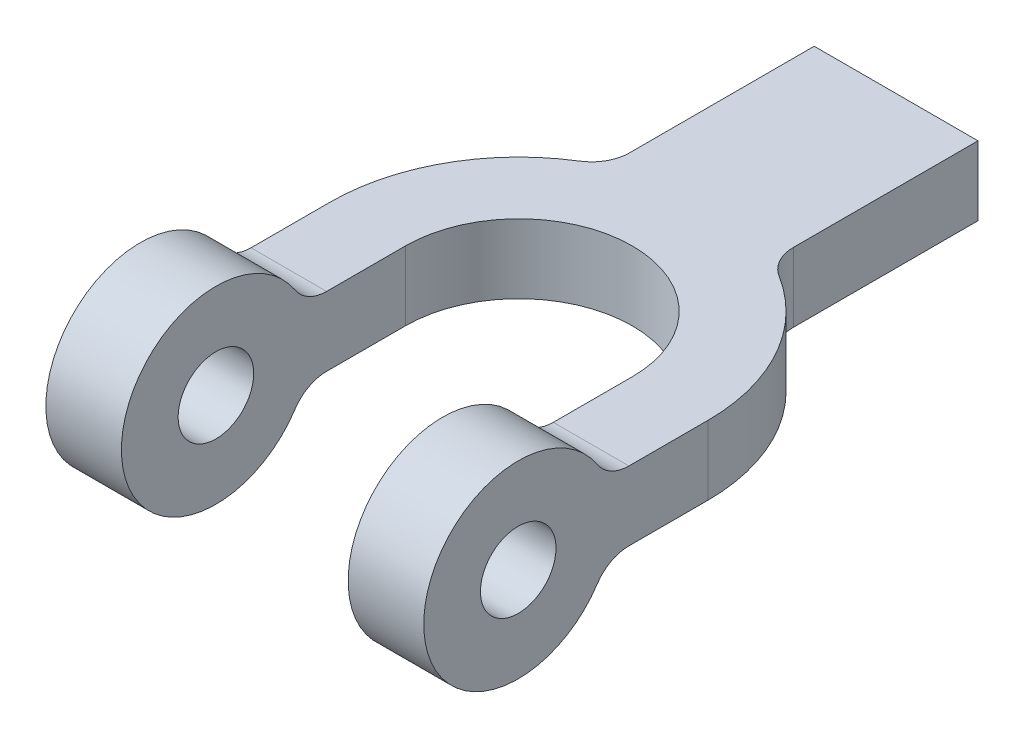
ISO-10303-21;
HEADER;
FILE_DESCRIPTION(('STEP AP214'),'2;1');
FILE_NAME('part.step','',(''),(''),'','','');
FILE_SCHEMA(('AUTOMOTIVE_DESIGN { 1 0 10303 214 1 1 1 1 }'));
ENDSEC;
DATA;
#1=APPLICATION_CONTEXT('core data for automotive mechanical design processes');
#2=APPLICATION_PROTOCOL_DEFINITION('international standard','automotive_design',2000,#1);
#3=PRODUCT_CONTEXT('',#1,'mechanical');
#4=PRODUCT('Part','Part','',(#3));
#5=PRODUCT_RELATED_PRODUCT_CATEGORY('part','',(#4));
#6=PRODUCT_DEFINITION_FORMATION('','',#4);
#7=PRODUCT_DEFINITION_CONTEXT('part definition',#1,'design');
#8=PRODUCT_DEFINITION('design','',#6,#7);
#9=PRODUCT_DEFINITION_SHAPE('','',#8);
#10=(LENGTH_UNIT() NAMED_UNIT(*) SI_UNIT(.MILLI.,.METRE.));
#11=(NAMED_UNIT(*) PLANE_ANGLE_UNIT() SI_UNIT($,.RADIAN.));
#12=(NAMED_UNIT(*) SI_UNIT($,.STERADIAN.) SOLID_ANGLE_UNIT());
#13=UNCERTAINTY_MEASURE_WITH_UNIT(LENGTH_MEASURE(1.E-05),#10,'distance_accuracy_value','');
#14=(GEOMETRIC_REPRESENTATION_CONTEXT(3) GLOBAL_UNCERTAINTY_ASSIGNED_CONTEXT((#13)) GLOBAL_UNIT_ASSIGNED_CONTEXT((#10,
#11,#12)) REPRESENTATION_CONTEXT('',''));
#15=CARTESIAN_POINT('',(0.,0.,0.));
#16=DIRECTION('',(0.,0.,1.));
#17=DIRECTION('',(1.,0.,0.));
#18=AXIS2_PLACEMENT_3D('',#15,#16,#17);
#19=CARTESIAN_POINT('',(-100.,100.,175.));
#20=DIRECTION('',(1.,0.,0.));
#21=DIRECTION('',(0.,0.,-1.));
#22=AXIS2_PLACEMENT_3D('',#19,#20,#21);
#23=PLANE('',#22);
#24=CARTESIAN_POINT('',(-100.,50.,125.));
#25=DIRECTION('',(1.,0.,0.));
#26=DIRECTION('',(0.,0.,-1.));
#27=AXIS2_PLACEMENT_3D('',#24,#25,#26);
#28=CIRCLE('',#27,20.);
#29=CARTESIAN_POINT('',(-100.,50.,105.));
#30=VERTEX_POINT('',#29);
#31=EDGE_CURVE('E409',#30,#30,#28,.T.);
#32=ORIENTED_EDGE('',*,*,#31,.T.);
#33=EDGE_LOOP('',(#32));
#34=FACE_BOUND('',#33,.T.);
#35=DIRECTION('',(0.,0.,-1.));
#36=VECTOR('',#35,1.);
#37=CARTESIAN_POINT('',(-100.,31.6804590253236,0.));
#38=LINE('',#37,#36);
#39=CARTESIAN_POINT('',(-100.,31.6804590253236,66.4200309022777));
#40=VERTEX_POINT('',#39);
#41=CARTESIAN_POINT('',(-100.,31.6804590253236,24.6443211616333));
#42=VERTEX_POINT('',#41);
#43=EDGE_CURVE('E282',#40,#42,#38,.T.);
#44=ORIENTED_EDGE('',*,*,#43,.F.);
#45=CARTESIAN_POINT('',(-100.,11.6804590253236,66.4200309022777));
#46=DIRECTION('',(1.,0.,0.));
#47=DIRECTION('',(0.,0.,-1.));
#48=AXIS2_PLACEMENT_3D('',#45,#46,#47);
#49=CIRCLE('',#48,20.);
#50=CARTESIAN_POINT('',(-100.,22.6288993038025,83.1571649301984));
#51=VERTEX_POINT('',#50);
#52=EDGE_CURVE('E293',#40,#51,#49,.T.);
#53=ORIENTED_EDGE('',*,*,#52,.T.);
#54=CARTESIAN_POINT('',(-100.,50.,125.));
#55=DIRECTION('',(1.,0.,0.));
#56=DIRECTION('',(0.,0.,-1.));
#57=AXIS2_PLACEMENT_3D('',#54,#55,#56);
#58=CIRCLE('',#57,50.);
#59=CARTESIAN_POINT('',(-100.,77.3711006961975,83.1571649301984));
#60=VERTEX_POINT('',#59);
#61=EDGE_CURVE('E422',#60,#51,#58,.T.);
#62=ORIENTED_EDGE('',*,*,#61,.F.);
#63=CARTESIAN_POINT('',(-100.,88.3195409746764,66.4200309022777));
#64=DIRECTION('',(1.,0.,0.));
#65=DIRECTION('',(0.,0.,-1.));
#66=AXIS2_PLACEMENT_3D('',#63,#64,#65);
#67=CIRCLE('',#66,20.);
#68=CARTESIAN_POINT('',(-100.,68.3195409746764,66.4200309022777));
#69=VERTEX_POINT('',#68);
#70=EDGE_CURVE('E322',#69,#60,#67,.F.);
#71=ORIENTED_EDGE('',*,*,#70,.F.);
#72=DIRECTION('',(0.,0.,-1.));
#73=VECTOR('',#72,1.);
#74=CARTESIAN_POINT('',(-100.,68.3195409746764,0.));
#75=LINE('',#74,#73);
#76=CARTESIAN_POINT('',(-100.,68.3195409746764,24.6443211616333));
#77=VERTEX_POINT('',#76);
#78=EDGE_CURVE('E326',#69,#77,#75,.T.);
#79=ORIENTED_EDGE('',*,*,#78,.T.);
#80=DIRECTION('',(0.,1.,0.));
#81=VECTOR('',#80,1.);
#82=CARTESIAN_POINT('',(-100.,0.,24.6443211616333));
#83=LINE('',#82,#81);
#84=EDGE_CURVE('E303',#42,#77,#83,.T.);
#85=ORIENTED_EDGE('',*,*,#84,.F.);
#86=EDGE_LOOP('',(#44,#53,#62,#71,#79,#85));
#87=FACE_BOUND('',#86,.T.);
#88=ADVANCED_FACE('F153',(#34,#87),#23,.F.);
#89=CARTESIAN_POINT('',(100.,100.,175.));
#90=DIRECTION('',(-1.,0.,0.));
#91=DIRECTION('',(0.,0.,1.));
#92=AXIS2_PLACEMENT_3D('',#89,#90,#91);
#93=PLANE('',#92);
#94=CARTESIAN_POINT('',(100.,50.,125.));
#95=DIRECTION('',(1.,0.,0.));
#96=DIRECTION('',(0.,0.,-1.));
#97=AXIS2_PLACEMENT_3D('',#94,#95,#96);
#98=CIRCLE('',#97,20.);
#99=CARTESIAN_POINT('',(100.,50.,105.));
#100=VERTEX_POINT('',#99);
#101=EDGE_CURVE('E408',#100,#100,#98,.T.);
#102=ORIENTED_EDGE('',*,*,#101,.F.);
#103=EDGE_LOOP('',(#102));
#104=FACE_BOUND('',#103,.T.);
#105=DIRECTION('',(0.,0.,-1.));
#106=VECTOR('',#105,1.);
#107=CARTESIAN_POINT('',(100.,31.6804590253236,0.));
#108=LINE('',#107,#106);
#109=CARTESIAN_POINT('',(100.,31.6804590253236,66.4200309022777));
#110=VERTEX_POINT('',#109);
#111=CARTESIAN_POINT('',(100.,31.6804590253236,24.6443211616333));
#112=VERTEX_POINT('',#111);
#113=EDGE_CURVE('E309',#110,#112,#108,.T.);
#114=ORIENTED_EDGE('',*,*,#113,.T.);
#115=DIRECTION('',(0.,1.,0.));
#116=VECTOR('',#115,1.);
#117=CARTESIAN_POINT('',(100.,0.,24.6443211616333));
#118=LINE('',#117,#116);
#119=CARTESIAN_POINT('',(100.,68.3195409746764,24.6443211616333));
#120=VERTEX_POINT('',#119);
#121=EDGE_CURVE('E434',#112,#120,#118,.T.);
#122=ORIENTED_EDGE('',*,*,#121,.T.);
#123=DIRECTION('',(0.,0.,-1.));
#124=VECTOR('',#123,1.);
#125=CARTESIAN_POINT('',(100.,68.3195409746764,0.));
#126=LINE('',#125,#124);
#127=CARTESIAN_POINT('',(100.,68.3195409746764,66.4200309022777));
#128=VERTEX_POINT('',#127);
#129=EDGE_CURVE('E327',#128,#120,#126,.T.);
#130=ORIENTED_EDGE('',*,*,#129,.F.);
#131=CARTESIAN_POINT('',(100.,88.3195409746764,66.4200309022777));
#132=DIRECTION('',(1.,0.,0.));
#133=DIRECTION('',(0.,0.,-1.));
#134=AXIS2_PLACEMENT_3D('',#131,#132,#133);
#135=CIRCLE('',#134,20.);
#136=CARTESIAN_POINT('',(100.,77.3711006961975,83.1571649301984));
#137=VERTEX_POINT('',#136);
#138=EDGE_CURVE('E331',#128,#137,#135,.F.);
#139=ORIENTED_EDGE('',*,*,#138,.T.);
#140=CARTESIAN_POINT('',(100.,50.,125.));
#141=DIRECTION('',(1.,0.,0.));
#142=DIRECTION('',(0.,0.,-1.));
#143=AXIS2_PLACEMENT_3D('',#140,#141,#142);
#144=CIRCLE('',#143,50.);
#145=CARTESIAN_POINT('',(100.,22.6288993038025,83.1571649301984));
#146=VERTEX_POINT('',#145);
#147=EDGE_CURVE('E421',#137,#146,#144,.T.);
#148=ORIENTED_EDGE('',*,*,#147,.T.);
#149=CARTESIAN_POINT('',(100.,11.6804590253236,66.4200309022777));
#150=DIRECTION('',(1.,0.,0.));
#151=DIRECTION('',(0.,0.,-1.));
#152=AXIS2_PLACEMENT_3D('',#149,#150,#151);
#153=CIRCLE('',#152,20.);
#154=EDGE_CURVE('E305',#110,#146,#153,.T.);
#155=ORIENTED_EDGE('',*,*,#154,.F.);
#156=EDGE_LOOP('',(#114,#122,#130,#139,#148,#155));
#157=FACE_BOUND('',#156,.T.);
#158=ADVANCED_FACE('F499',(#104,#157),#93,.F.);
#159=CARTESIAN_POINT('',(-60.,0.,0.));
#160=DIRECTION('',(-1.,0.,0.));
#161=DIRECTION('',(0.,0.,1.));
#162=AXIS2_PLACEMENT_3D('',#159,#160,#161);
#163=PLANE('',#162);
#164=CARTESIAN_POINT('',(-60.,50.,125.));
#165=DIRECTION('',(-1.,0.,0.));
#166=DIRECTION('',(0.,0.,1.));
#167=AXIS2_PLACEMENT_3D('',#164,#165,#166);
#168=CIRCLE('',#167,20.);
#169=CARTESIAN_POINT('',(-60.,50.,145.));
#170=VERTEX_POINT('',#169);
#171=EDGE_CURVE('E417',#170,#170,#168,.T.);
#172=ORIENTED_EDGE('',*,*,#171,.T.);
#173=EDGE_LOOP('',(#172));
#174=FACE_BOUND('',#173,.T.);
#175=DIRECTION('',(0.,0.,1.));
#176=VECTOR('',#175,1.);
#177=CARTESIAN_POINT('',(-60.,31.6804590253236,0.));
#178=LINE('',#177,#176);
#179=CARTESIAN_POINT('',(-60.,31.6804590253236,24.6443211616333));
#180=VERTEX_POINT('',#179);
#181=CARTESIAN_POINT('',(-60.,31.6804590253236,66.4200309022777));
#182=VERTEX_POINT('',#181);
#183=EDGE_CURVE('E285',#180,#182,#178,.T.);
#184=ORIENTED_EDGE('',*,*,#183,.F.);
#185=DIRECTION('',(0.,1.,0.));
#186=VECTOR('',#185,1.);
#187=CARTESIAN_POINT('',(-60.,0.,24.6443211616333));
#188=LINE('',#187,#186);
#189=CARTESIAN_POINT('',(-60.,68.3195409746764,24.6443211616333));
#190=VERTEX_POINT('',#189);
#191=EDGE_CURVE('E430',#180,#190,#188,.T.);
#192=ORIENTED_EDGE('',*,*,#191,.T.);
#193=DIRECTION('',(0.,0.,1.));
#194=VECTOR('',#193,1.);
#195=CARTESIAN_POINT('',(-60.,68.3195409746764,0.));
#196=LINE('',#195,#194);
#197=CARTESIAN_POINT('',(-60.,68.3195409746764,66.4200309022777));
#198=VERTEX_POINT('',#197);
#199=EDGE_CURVE('E362',#190,#198,#196,.T.);
#200=ORIENTED_EDGE('',*,*,#199,.T.);
#201=CARTESIAN_POINT('',(-60.,88.3195409746764,66.4200309022777));
#202=DIRECTION('',(-1.,0.,0.));
#203=DIRECTION('',(0.,0.,1.));
#204=AXIS2_PLACEMENT_3D('',#201,#202,#203);
#205=CIRCLE('',#204,20.);
#206=CARTESIAN_POINT('',(-60.,77.3711006961975,83.1571649301984));
#207=VERTEX_POINT('',#206);
#208=EDGE_CURVE('E402',#207,#198,#205,.F.);
#209=ORIENTED_EDGE('',*,*,#208,.F.);
#210=CARTESIAN_POINT('',(-60.,50.,125.));
#211=DIRECTION('',(-1.,0.,0.));
#212=DIRECTION('',(0.,0.,1.));
#213=AXIS2_PLACEMENT_3D('',#210,#211,#212);
#214=CIRCLE('',#213,50.);
#215=CARTESIAN_POINT('',(-60.,22.6288993038025,83.1571649301984));
#216=VERTEX_POINT('',#215);
#217=EDGE_CURVE('E176',#216,#207,#214,.T.);
#218=ORIENTED_EDGE('',*,*,#217,.F.);
#219=CARTESIAN_POINT('',(-60.,11.6804590253236,66.4200309022777));
#220=DIRECTION('',(-1.,0.,0.));
#221=DIRECTION('',(0.,0.,1.));
#222=AXIS2_PLACEMENT_3D('',#219,#220,#221);
#223=CIRCLE('',#222,20.);
#224=EDGE_CURVE('E405',#216,#182,#223,.T.);
#225=ORIENTED_EDGE('',*,*,#224,.T.);
#226=EDGE_LOOP('',(#184,#192,#200,#209,#218,#225));
#227=FACE_BOUND('',#226,.T.);
#228=ADVANCED_FACE('F552',(#174,#227),#163,.F.);
#229=CARTESIAN_POINT('',(60.,0.,0.));
#230=DIRECTION('',(-1.,0.,0.));
#231=DIRECTION('',(0.,0.,1.));
#232=AXIS2_PLACEMENT_3D('',#229,#230,#231);
#233=PLANE('',#232);
#234=CARTESIAN_POINT('',(60.,50.,125.));
#235=DIRECTION('',(-1.,0.,0.));
#236=DIRECTION('',(0.,0.,1.));
#237=AXIS2_PLACEMENT_3D('',#234,#235,#236);
#238=CIRCLE('',#237,20.);
#239=CARTESIAN_POINT('',(60.,50.,145.));
#240=VERTEX_POINT('',#239);
#241=EDGE_CURVE('E413',#240,#240,#238,.T.);
#242=ORIENTED_EDGE('',*,*,#241,.F.);
#243=EDGE_LOOP('',(#242));
#244=FACE_BOUND('',#243,.T.);
#245=DIRECTION('',(0.,1.,0.));
#246=VECTOR('',#245,1.);
#247=CARTESIAN_POINT('',(60.,0.,24.6443211616333));
#248=LINE('',#247,#246);
#249=CARTESIAN_POINT('',(60.,31.6804590253236,24.6443211616333));
#250=VERTEX_POINT('',#249);
#251=CARTESIAN_POINT('',(60.,68.3195409746764,24.6443211616333));
#252=VERTEX_POINT('',#251);
#253=EDGE_CURVE('E429',#250,#252,#248,.T.);
#254=ORIENTED_EDGE('',*,*,#253,.F.);
#255=DIRECTION('',(0.,0.,1.));
#256=VECTOR('',#255,1.);
#257=CARTESIAN_POINT('',(60.,31.6804590253236,0.));
#258=LINE('',#257,#256);
#259=CARTESIAN_POINT('',(60.,31.6804590253236,66.4200309022777));
#260=VERTEX_POINT('',#259);
#261=EDGE_CURVE('E386',#250,#260,#258,.T.);
#262=ORIENTED_EDGE('',*,*,#261,.T.);
#263=CARTESIAN_POINT('',(60.,11.6804590253236,66.4200309022777));
#264=DIRECTION('',(-1.,0.,0.));
#265=DIRECTION('',(0.,0.,1.));
#266=AXIS2_PLACEMENT_3D('',#263,#264,#265);
#267=CIRCLE('',#266,20.);
#268=CARTESIAN_POINT('',(60.,22.6288993038025,83.1571649301984));
#269=VERTEX_POINT('',#268);
#270=EDGE_CURVE('E12',#269,#260,#267,.T.);
#271=ORIENTED_EDGE('',*,*,#270,.F.);
#272=CARTESIAN_POINT('',(60.,50.,125.));
#273=DIRECTION('',(-1.,0.,0.));
#274=DIRECTION('',(0.,0.,1.));
#275=AXIS2_PLACEMENT_3D('',#272,#273,#274);
#276=CIRCLE('',#275,50.);
#277=CARTESIAN_POINT('',(60.,77.3711006961975,83.1571649301984));
#278=VERTEX_POINT('',#277);
#279=EDGE_CURVE('E168',#269,#278,#276,.T.);
#280=ORIENTED_EDGE('',*,*,#279,.T.);
#281=CARTESIAN_POINT('',(60.,88.3195409746764,66.4200309022777));
#282=DIRECTION('',(-1.,0.,0.));
#283=DIRECTION('',(0.,0.,1.));
#284=AXIS2_PLACEMENT_3D('',#281,#282,#283);
#285=CIRCLE('',#284,20.);
#286=CARTESIAN_POINT('',(60.,68.3195409746764,66.4200309022777));
#287=VERTEX_POINT('',#286);
#288=EDGE_CURVE('E161',#278,#287,#285,.F.);
#289=ORIENTED_EDGE('',*,*,#288,.T.);
#290=DIRECTION('',(0.,0.,1.));
#291=VECTOR('',#290,1.);
#292=CARTESIAN_POINT('',(60.,68.3195409746764,0.));
#293=LINE('',#292,#291);
#294=EDGE_CURVE('E359',#252,#287,#293,.T.);
#295=ORIENTED_EDGE('',*,*,#294,.F.);
#296=EDGE_LOOP('',(#254,#262,#271,#280,#289,#295));
#297=FACE_BOUND('',#296,.T.);
#298=ADVANCED_FACE('F484',(#244,#297),#233,.T.);
#299=CARTESIAN_POINT('',(100.,100.,-175.));
#300=DIRECTION('',(0.,0.,1.));
#301=DIRECTION('',(1.,0.,0.));
#302=AXIS2_PLACEMENT_3D('',#299,#300,#301);
#303=PLANE('',#302);
#304=DIRECTION('',(1.,0.,0.));
#305=VECTOR('',#304,1.);
#306=CARTESIAN_POINT('',(-100.,31.6804590253236,-175.));
#307=LINE('',#306,#305);
#308=CARTESIAN_POINT('',(-43.347633030871,31.6804590253236,-175.));
#309=VERTEX_POINT('',#308);
#310=CARTESIAN_POINT('',(43.3476330308709,31.6804590253236,-175.));
#311=VERTEX_POINT('',#310);
#312=EDGE_CURVE('E316',#309,#311,#307,.T.);
#313=ORIENTED_EDGE('',*,*,#312,.F.);
#314=DIRECTION('',(0.,1.,0.));
#315=VECTOR('',#314,1.);
#316=CARTESIAN_POINT('',(-43.3476330308709,0.,-175.));
#317=LINE('',#316,#315);
#318=CARTESIAN_POINT('',(-43.3476330308709,68.3195409746764,-175.));
#319=VERTEX_POINT('',#318);
#320=EDGE_CURVE('E456',#309,#319,#317,.T.);
#321=ORIENTED_EDGE('',*,*,#320,.T.);
#322=DIRECTION('',(1.,0.,0.));
#323=VECTOR('',#322,1.);
#324=CARTESIAN_POINT('',(-100.,68.3195409746764,-175.));
#325=LINE('',#324,#323);
#326=CARTESIAN_POINT('',(43.3476330308709,68.3195409746764,-175.));
#327=VERTEX_POINT('',#326);
#328=EDGE_CURVE('E341',#319,#327,#325,.T.);
#329=ORIENTED_EDGE('',*,*,#328,.T.);
#330=DIRECTION('',(0.,1.,0.));
#331=VECTOR('',#330,1.);
#332=CARTESIAN_POINT('',(43.3476330308709,0.,-175.));
#333=LINE('',#332,#331);
#334=EDGE_CURVE('E447',#311,#327,#333,.T.);
#335=ORIENTED_EDGE('',*,*,#334,.F.);
#336=EDGE_LOOP('',(#313,#321,#329,#335));
#337=FACE_BOUND('',#336,.T.);
#338=ADVANCED_FACE('F517',(#337),#303,.F.);
#339=CARTESIAN_POINT('',(0.,0.,24.6443211616333));
#340=DIRECTION('',(0.,1.,0.));
#341=DIRECTION('',(0.,0.,1.));
#342=AXIS2_PLACEMENT_3D('',#339,#340,#341);
#343=CYLINDRICAL_SURFACE('',#342,100.);
#344=DIRECTION('',(0.,1.,0.));
#345=VECTOR('',#344,1.);
#346=CARTESIAN_POINT('',(-52.7896941923924,0.,-60.2865223940132));
#347=LINE('',#346,#345);
#348=CARTESIAN_POINT('',(-52.7896941923924,31.6804590253236,-60.2865223940132));
#349=VERTEX_POINT('',#348);
#350=CARTESIAN_POINT('',(-52.7896941923924,68.3195409746764,-60.2865223940132));
#351=VERTEX_POINT('',#350);
#352=EDGE_CURVE('E442',#349,#351,#347,.T.);
#353=ORIENTED_EDGE('',*,*,#352,.F.);
#354=CARTESIAN_POINT('',(0.,31.6804590253236,24.6443211616333));
#355=DIRECTION('',(0.,-1.,0.));
#356=DIRECTION('',(0.,0.,-1.));
#357=AXIS2_PLACEMENT_3D('',#354,#355,#356);
#358=CIRCLE('',#357,100.);
#359=EDGE_CURVE('E399',#349,#42,#358,.F.);
#360=ORIENTED_EDGE('',*,*,#359,.T.);
#361=ORIENTED_EDGE('',*,*,#84,.T.);
#362=CARTESIAN_POINT('',(0.,68.3195409746764,24.6443211616333));
#363=DIRECTION('',(0.,-1.,0.));
#364=DIRECTION('',(0.,0.,-1.));
#365=AXIS2_PLACEMENT_3D('',#362,#363,#364);
#366=CIRCLE('',#365,100.);
#367=EDGE_CURVE('E373',#351,#77,#366,.F.);
#368=ORIENTED_EDGE('',*,*,#367,.F.);
#369=EDGE_LOOP('',(#353,#360,#361,#368));
#370=FACE_BOUND('',#369,.T.);
#371=ADVANCED_FACE('F528',(#370),#343,.T.);
#372=CARTESIAN_POINT('',(-43.3476330308709,0.,0.));
#373=DIRECTION('',(-1.,0.,0.));
#374=DIRECTION('',(0.,0.,1.));
#375=AXIS2_PLACEMENT_3D('',#372,#373,#374);
#376=PLANE('',#375);
#377=ORIENTED_EDGE('',*,*,#320,.F.);
#378=DIRECTION('',(0.,0.,1.));
#379=VECTOR('',#378,1.);
#380=CARTESIAN_POINT('',(-43.3476330308709,31.6804590253236,0.));
#381=LINE('',#380,#379);
#382=CARTESIAN_POINT('',(-43.3476330308709,31.6804590253236,-77.2726911051425));
#383=VERTEX_POINT('',#382);
#384=EDGE_CURVE('E395',#309,#383,#381,.T.);
#385=ORIENTED_EDGE('',*,*,#384,.T.);
#386=DIRECTION('',(0.,1.,0.));
#387=VECTOR('',#386,1.);
#388=CARTESIAN_POINT('',(-43.3476330308709,0.,-77.2726911051425));
#389=LINE('',#388,#387);
#390=CARTESIAN_POINT('',(-43.3476330308709,68.3195409746764,-77.2726911051425));
#391=VERTEX_POINT('',#390);
#392=EDGE_CURVE('E460',#383,#391,#389,.T.);
#393=ORIENTED_EDGE('',*,*,#392,.T.);
#394=DIRECTION('',(0.,0.,1.));
#395=VECTOR('',#394,1.);
#396=CARTESIAN_POINT('',(-43.3476330308709,68.3195409746764,0.));
#397=LINE('',#396,#395);
#398=EDGE_CURVE('E370',#319,#391,#397,.T.);
#399=ORIENTED_EDGE('',*,*,#398,.F.);
#400=EDGE_LOOP('',(#377,#385,#393,#399));
#401=FACE_BOUND('',#400,.T.);
#402=ADVANCED_FACE('F520',(#401),#376,.T.);
#403=CARTESIAN_POINT('',(-63.3476330308709,0.,-77.2726911051425));
#404=DIRECTION('',(0.,1.,0.));
#405=DIRECTION('',(0.,0.,1.));
#406=AXIS2_PLACEMENT_3D('',#403,#404,#405);
#407=CYLINDRICAL_SURFACE('',#406,20.);
#408=CARTESIAN_POINT('',(-63.3476330308709,31.6804590253236,-77.2726911051425));
#409=DIRECTION('',(0.,-1.,0.));
#410=DIRECTION('',(0.,0.,-1.));
#411=AXIS2_PLACEMENT_3D('',#408,#409,#410);
#412=CIRCLE('',#411,20.);
#413=EDGE_CURVE('E392',#349,#383,#412,.F.);
#414=ORIENTED_EDGE('',*,*,#413,.F.);
#415=ORIENTED_EDGE('',*,*,#352,.T.);
#416=CARTESIAN_POINT('',(-63.3476330308709,68.3195409746764,-77.2726911051425));
#417=DIRECTION('',(0.,-1.,0.));
#418=DIRECTION('',(0.,0.,-1.));
#419=AXIS2_PLACEMENT_3D('',#416,#417,#418);
#420=CIRCLE('',#419,20.);
#421=EDGE_CURVE('E366',#351,#391,#420,.F.);
#422=ORIENTED_EDGE('',*,*,#421,.T.);
#423=ORIENTED_EDGE('',*,*,#392,.F.);
#424=EDGE_LOOP('',(#414,#415,#422,#423));
#425=FACE_BOUND('',#424,.T.);
#426=ADVANCED_FACE('F525',(#425),#407,.F.);
#427=CARTESIAN_POINT('',(0.,0.,24.6443211616333));
#428=DIRECTION('',(0.,1.,0.));
#429=DIRECTION('',(0.,0.,1.));
#430=AXIS2_PLACEMENT_3D('',#427,#428,#429);
#431=CYLINDRICAL_SURFACE('',#430,60.);
#432=CARTESIAN_POINT('',(0.,31.6804590253236,24.6443211616333));
#433=DIRECTION('',(0.,-1.,0.));
#434=DIRECTION('',(0.,0.,-1.));
#435=AXIS2_PLACEMENT_3D('',#432,#433,#434);
#436=CIRCLE('',#435,60.);
#437=EDGE_CURVE('E383',#250,#180,#436,.F.);
#438=ORIENTED_EDGE('',*,*,#437,.F.);
#439=ORIENTED_EDGE('',*,*,#253,.T.);
#440=CARTESIAN_POINT('',(0.,68.3195409746764,24.6443211616333));
#441=DIRECTION('',(0.,-1.,0.));
#442=DIRECTION('',(0.,0.,-1.));
#443=AXIS2_PLACEMENT_3D('',#440,#441,#442);
#444=CIRCLE('',#443,60.);
#445=EDGE_CURVE('E355',#252,#190,#444,.F.);
#446=ORIENTED_EDGE('',*,*,#445,.T.);
#447=ORIENTED_EDGE('',*,*,#191,.F.);
#448=EDGE_LOOP('',(#438,#439,#446,#447));
#449=FACE_BOUND('',#448,.T.);
#450=ADVANCED_FACE('F565',(#449),#431,.F.);
#451=CARTESIAN_POINT('',(0.,0.,24.6443211616333));
#452=DIRECTION('',(0.,1.,0.));
#453=DIRECTION('',(0.,0.,1.));
#454=AXIS2_PLACEMENT_3D('',#451,#452,#453);
#455=CYLINDRICAL_SURFACE('',#454,100.);
#456=ORIENTED_EDGE('',*,*,#121,.F.);
#457=CARTESIAN_POINT('',(0.,31.6804590253236,24.6443211616333));
#458=DIRECTION('',(0.,-1.,0.));
#459=DIRECTION('',(0.,0.,-1.));
#460=AXIS2_PLACEMENT_3D('',#457,#458,#459);
#461=CIRCLE('',#460,100.);
#462=CARTESIAN_POINT('',(52.7896941923924,31.6804590253236,-60.2865223940132));
#463=VERTEX_POINT('',#462);
#464=EDGE_CURVE('E379',#112,#463,#461,.F.);
#465=ORIENTED_EDGE('',*,*,#464,.T.);
#466=DIRECTION('',(0.,1.,0.));
#467=VECTOR('',#466,1.);
#468=CARTESIAN_POINT('',(52.7896941923924,0.,-60.2865223940132));
#469=LINE('',#468,#467);
#470=CARTESIAN_POINT('',(52.7896941923924,68.3195409746764,-60.2865223940132));
#471=VERTEX_POINT('',#470);
#472=EDGE_CURVE('E438',#463,#471,#469,.T.);
#473=ORIENTED_EDGE('',*,*,#472,.T.);
#474=CARTESIAN_POINT('',(0.,68.3195409746764,24.6443211616333));
#475=DIRECTION('',(0.,-1.,0.));
#476=DIRECTION('',(0.,0.,-1.));
#477=AXIS2_PLACEMENT_3D('',#474,#475,#476);
#478=CIRCLE('',#477,100.);
#479=EDGE_CURVE('E352',#120,#471,#478,.F.);
#480=ORIENTED_EDGE('',*,*,#479,.F.);
#481=EDGE_LOOP('',(#456,#465,#473,#480));
#482=FACE_BOUND('',#481,.T.);
#483=ADVANCED_FACE('F504',(#482),#455,.T.);
#484=CARTESIAN_POINT('',(63.3476330308709,0.,-77.2726911051425));
#485=DIRECTION('',(0.,1.,0.));
#486=DIRECTION('',(0.,0.,1.));
#487=AXIS2_PLACEMENT_3D('',#484,#485,#486);
#488=CYLINDRICAL_SURFACE('',#487,20.);
#489=CARTESIAN_POINT('',(63.3476330308709,31.6804590253236,-77.2726911051425));
#490=DIRECTION('',(0.,-1.,0.));
#491=DIRECTION('',(0.,0.,-1.));
#492=AXIS2_PLACEMENT_3D('',#489,#490,#491);
#493=CIRCLE('',#492,20.);
#494=CARTESIAN_POINT('',(43.3476330308709,31.6804590253236,-77.2726911051425));
#495=VERTEX_POINT('',#494);
#496=EDGE_CURVE('E376',#495,#463,#493,.F.);
#497=ORIENTED_EDGE('',*,*,#496,.F.);
#498=DIRECTION('',(0.,1.,0.));
#499=VECTOR('',#498,1.);
#500=CARTESIAN_POINT('',(43.3476330308709,0.,-77.2726911051425));
#501=LINE('',#500,#499);
#502=CARTESIAN_POINT('',(43.3476330308709,68.3195409746764,-77.2726911051425));
#503=VERTEX_POINT('',#502);
#504=EDGE_CURVE('E443',#495,#503,#501,.T.);
#505=ORIENTED_EDGE('',*,*,#504,.T.);
#506=CARTESIAN_POINT('',(63.3476330308709,68.3195409746764,-77.2726911051425));
#507=DIRECTION('',(0.,-1.,0.));
#508=DIRECTION('',(0.,0.,-1.));
#509=AXIS2_PLACEMENT_3D('',#506,#507,#508);
#510=CIRCLE('',#509,20.);
#511=EDGE_CURVE('E319',#503,#471,#510,.F.);
#512=ORIENTED_EDGE('',*,*,#511,.T.);
#513=ORIENTED_EDGE('',*,*,#472,.F.);
#514=EDGE_LOOP('',(#497,#505,#512,#513));
#515=FACE_BOUND('',#514,.T.);
#516=ADVANCED_FACE('F508',(#515),#488,.F.);
#517=CARTESIAN_POINT('',(43.3476330308709,0.,0.));
#518=DIRECTION('',(-1.,0.,0.));
#519=DIRECTION('',(0.,0.,1.));
#520=AXIS2_PLACEMENT_3D('',#517,#518,#519);
#521=PLANE('',#520);
#522=DIRECTION('',(0.,0.,1.));
#523=VECTOR('',#522,1.);
#524=CARTESIAN_POINT('',(43.3476330308709,31.6804590253236,0.));
#525=LINE('',#524,#523);
#526=EDGE_CURVE('E476',#311,#495,#525,.T.);
#527=ORIENTED_EDGE('',*,*,#526,.F.);
#528=ORIENTED_EDGE('',*,*,#334,.T.);
#529=DIRECTION('',(0.,0.,1.));
#530=VECTOR('',#529,1.);
#531=CARTESIAN_POINT('',(43.3476330308709,68.3195409746764,0.));
#532=LINE('',#531,#530);
#533=EDGE_CURVE('E469',#327,#503,#532,.T.);
#534=ORIENTED_EDGE('',*,*,#533,.T.);
#535=ORIENTED_EDGE('',*,*,#504,.F.);
#536=EDGE_LOOP('',(#527,#528,#534,#535));
#537=FACE_BOUND('',#536,.T.);
#538=ADVANCED_FACE('F512',(#537),#521,.F.);
#539=CARTESIAN_POINT('',(-100.,50.,125.));
#540=DIRECTION('',(1.,0.,0.));
#541=DIRECTION('',(0.,0.,-1.));
#542=AXIS2_PLACEMENT_3D('',#539,#540,#541);
#543=CYLINDRICAL_SURFACE('',#542,50.);
#544=ORIENTED_EDGE('',*,*,#279,.F.);
#545=DIRECTION('',(1.,0.,0.));
#546=VECTOR('',#545,1.);
#547=CARTESIAN_POINT('',(-100.,22.6288993038025,83.1571649301984));
#548=LINE('',#547,#546);
#549=EDGE_CURVE('E288',#269,#146,#548,.T.);
#550=ORIENTED_EDGE('',*,*,#549,.T.);
#551=ORIENTED_EDGE('',*,*,#147,.F.);
#552=DIRECTION('',(1.,0.,0.));
#553=VECTOR('',#552,1.);
#554=CARTESIAN_POINT('',(-100.,77.3711006961975,83.1571649301984));
#555=LINE('',#554,#553);
#556=EDGE_CURVE('E340',#278,#137,#555,.T.);
#557=ORIENTED_EDGE('',*,*,#556,.F.);
#558=EDGE_LOOP('',(#544,#550,#551,#557));
#559=FACE_BOUND('',#558,.T.);
#560=ADVANCED_FACE('F491',(#559),#543,.T.);
#561=ORIENTED_EDGE('',*,*,#217,.T.);
#562=EDGE_CURVE('E314',#60,#207,#555,.T.);
#563=ORIENTED_EDGE('',*,*,#562,.F.);
#564=ORIENTED_EDGE('',*,*,#61,.T.);
#565=EDGE_CURVE('E296',#51,#216,#548,.T.);
#566=ORIENTED_EDGE('',*,*,#565,.T.);
#567=EDGE_LOOP('',(#561,#563,#564,#566));
#568=FACE_BOUND('',#567,.T.);
#569=ADVANCED_FACE('F535',(#568),#543,.T.);
#570=CARTESIAN_POINT('',(-100.,50.,125.));
#571=DIRECTION('',(1.,0.,0.));
#572=DIRECTION('',(0.,0.,-1.));
#573=AXIS2_PLACEMENT_3D('',#570,#571,#572);
#574=CYLINDRICAL_SURFACE('',#573,20.);
#575=ORIENTED_EDGE('',*,*,#241,.T.);
#576=EDGE_LOOP('',(#575));
#577=FACE_BOUND('',#576,.T.);
#578=ORIENTED_EDGE('',*,*,#101,.T.);
#579=EDGE_LOOP('',(#578));
#580=FACE_BOUND('',#579,.T.);
#581=ADVANCED_FACE('F537',(#577,#580),#574,.F.);
#582=ORIENTED_EDGE('',*,*,#31,.F.);
#583=EDGE_LOOP('',(#582));
#584=FACE_BOUND('',#583,.T.);
#585=ORIENTED_EDGE('',*,*,#171,.F.);
#586=EDGE_LOOP('',(#585));
#587=FACE_BOUND('',#586,.T.);
#588=ADVANCED_FACE('F543',(#584,#587),#574,.F.);
#589=CARTESIAN_POINT('',(-100.,88.3195409746764,66.4200309022777));
#590=DIRECTION('',(1.,0.,0.));
#591=DIRECTION('',(0.,0.,-1.));
#592=AXIS2_PLACEMENT_3D('',#589,#590,#591);
#593=CYLINDRICAL_SURFACE('',#592,20.);
#594=ORIENTED_EDGE('',*,*,#208,.T.);
#595=DIRECTION('',(1.,0.,0.));
#596=VECTOR('',#595,1.);
#597=CARTESIAN_POINT('',(-100.,68.3195409746764,66.4200309022777));
#598=LINE('',#597,#596);
#599=EDGE_CURVE('E345',#69,#198,#598,.T.);
#600=ORIENTED_EDGE('',*,*,#599,.F.);
#601=ORIENTED_EDGE('',*,*,#70,.T.);
#602=ORIENTED_EDGE('',*,*,#562,.T.);
#603=EDGE_LOOP('',(#594,#600,#601,#602));
#604=FACE_BOUND('',#603,.T.);
#605=ADVANCED_FACE('F533',(#604),#593,.F.);
#606=CARTESIAN_POINT('',(-100.,68.3195409746764,0.));
#607=DIRECTION('',(0.,-1.,0.));
#608=DIRECTION('',(0.,0.,-1.));
#609=AXIS2_PLACEMENT_3D('',#606,#607,#608);
#610=PLANE('',#609);
#611=ORIENTED_EDGE('',*,*,#367,.T.);
#612=ORIENTED_EDGE('',*,*,#78,.F.);
#613=ORIENTED_EDGE('',*,*,#599,.T.);
#614=ORIENTED_EDGE('',*,*,#199,.F.);
#615=ORIENTED_EDGE('',*,*,#445,.F.);
#616=ORIENTED_EDGE('',*,*,#294,.T.);
#617=EDGE_CURVE('E330',#287,#128,#598,.T.);
#618=ORIENTED_EDGE('',*,*,#617,.T.);
#619=ORIENTED_EDGE('',*,*,#129,.T.);
#620=ORIENTED_EDGE('',*,*,#479,.T.);
#621=ORIENTED_EDGE('',*,*,#511,.F.);
#622=ORIENTED_EDGE('',*,*,#533,.F.);
#623=ORIENTED_EDGE('',*,*,#328,.F.);
#624=ORIENTED_EDGE('',*,*,#398,.T.);
#625=ORIENTED_EDGE('',*,*,#421,.F.);
#626=EDGE_LOOP('',(#611,#612,#613,#614,#615,#616,#618,#619,#620,#621,#622,#623,#624,#625));
#627=FACE_BOUND('',#626,.T.);
#628=ADVANCED_FACE('F495',(#627),#610,.F.);
#629=ORIENTED_EDGE('',*,*,#556,.T.);
#630=ORIENTED_EDGE('',*,*,#138,.F.);
#631=ORIENTED_EDGE('',*,*,#617,.F.);
#632=ORIENTED_EDGE('',*,*,#288,.F.);
#633=EDGE_LOOP('',(#629,#630,#631,#632));
#634=FACE_BOUND('',#633,.T.);
#635=ADVANCED_FACE('F489',(#634),#593,.F.);
#636=CARTESIAN_POINT('',(-100.,11.6804590253236,66.4200309022777));
#637=DIRECTION('',(1.,0.,0.));
#638=DIRECTION('',(0.,0.,-1.));
#639=AXIS2_PLACEMENT_3D('',#636,#637,#638);
#640=CYLINDRICAL_SURFACE('',#639,20.);
#641=ORIENTED_EDGE('',*,*,#565,.F.);
#642=ORIENTED_EDGE('',*,*,#52,.F.);
#643=DIRECTION('',(1.,0.,0.));
#644=VECTOR('',#643,1.);
#645=CARTESIAN_POINT('',(-100.,31.6804590253236,66.4200309022777));
#646=LINE('',#645,#644);
#647=EDGE_CURVE('E278',#40,#182,#646,.T.);
#648=ORIENTED_EDGE('',*,*,#647,.T.);
#649=ORIENTED_EDGE('',*,*,#224,.F.);
#650=EDGE_LOOP('',(#641,#642,#648,#649));
#651=FACE_BOUND('',#650,.T.);
#652=ADVANCED_FACE('F294',(#651),#640,.F.);
#653=CARTESIAN_POINT('',(-100.,31.6804590253236,0.));
#654=DIRECTION('',(0.,-1.,0.));
#655=DIRECTION('',(0.,0.,-1.));
#656=AXIS2_PLACEMENT_3D('',#653,#654,#655);
#657=PLANE('',#656);
#658=ORIENTED_EDGE('',*,*,#413,.T.);
#659=ORIENTED_EDGE('',*,*,#384,.F.);
#660=ORIENTED_EDGE('',*,*,#312,.T.);
#661=ORIENTED_EDGE('',*,*,#526,.T.);
#662=ORIENTED_EDGE('',*,*,#496,.T.);
#663=ORIENTED_EDGE('',*,*,#464,.F.);
#664=ORIENTED_EDGE('',*,*,#113,.F.);
#665=EDGE_CURVE('E289',#260,#110,#646,.T.);
#666=ORIENTED_EDGE('',*,*,#665,.F.);
#667=ORIENTED_EDGE('',*,*,#261,.F.);
#668=ORIENTED_EDGE('',*,*,#437,.T.);
#669=ORIENTED_EDGE('',*,*,#183,.T.);
#670=ORIENTED_EDGE('',*,*,#647,.F.);
#671=ORIENTED_EDGE('',*,*,#43,.T.);
#672=ORIENTED_EDGE('',*,*,#359,.F.);
#673=EDGE_LOOP('',(#658,#659,#660,#661,#662,#663,#664,#666,#667,#668,#669,#670,#671,#672));
#674=FACE_BOUND('',#673,.T.);
#675=ADVANCED_FACE('F280',(#674),#657,.T.);
#676=ORIENTED_EDGE('',*,*,#270,.T.);
#677=ORIENTED_EDGE('',*,*,#665,.T.);
#678=ORIENTED_EDGE('',*,*,#154,.T.);
#679=ORIENTED_EDGE('',*,*,#549,.F.);
#680=EDGE_LOOP('',(#676,#677,#678,#679));
#681=FACE_BOUND('',#680,.T.);
#682=ADVANCED_FACE('F570',(#681),#640,.F.);
#683=CLOSED_SHELL('',(#88,#158,#228,#298,#338,#371,#402,#426,#450,#483,#516,#538,#560,#569,#581,
#588,#605,#628,#635,#652,#675,#682));
#684=MANIFOLD_SOLID_BREP('B2',#683);
#685=ADVANCED_BREP_SHAPE_REPRESENTATION('',(#18,#684),#14);
#686=SHAPE_DEFINITION_REPRESENTATION(#9,#685);
ENDSEC;
END-ISO-10303-21;
